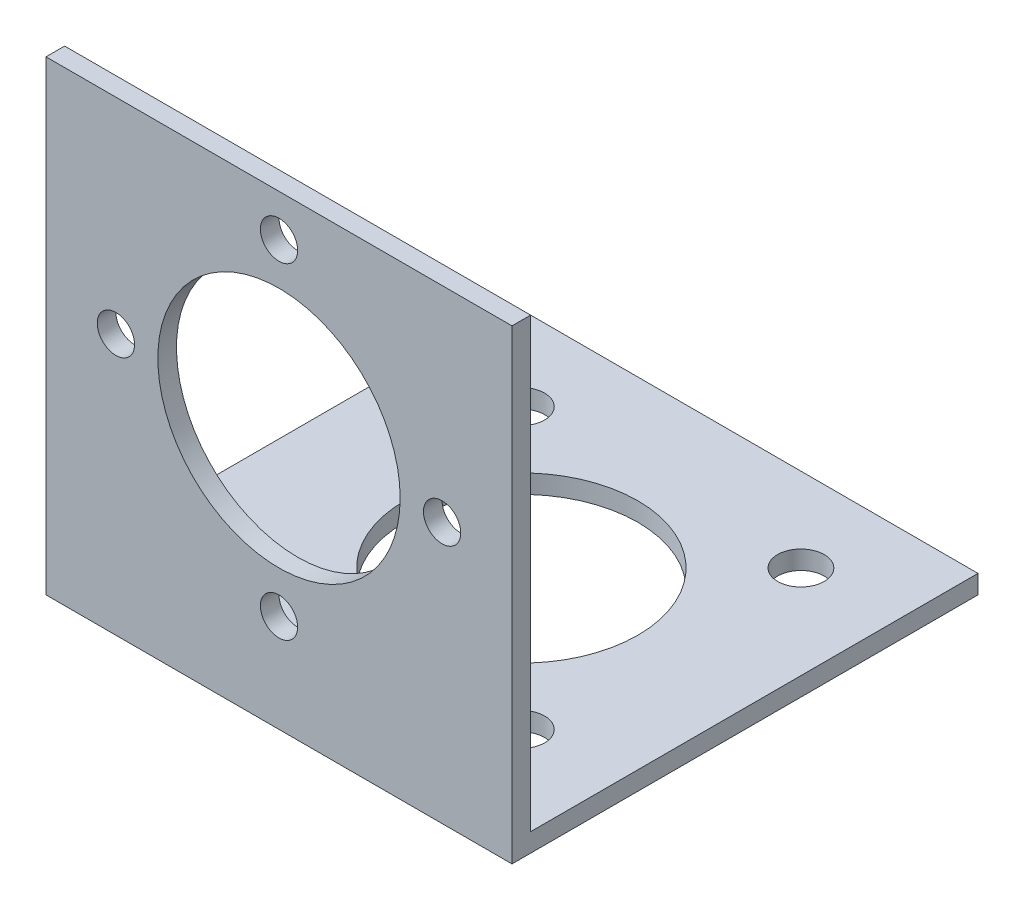
ISO-10303-21;
HEADER;
FILE_DESCRIPTION(('STEP AP214'),'2;1');
FILE_NAME('part.step','',(''),(''),'','','');
FILE_SCHEMA(('AUTOMOTIVE_DESIGN { 1 0 10303 214 1 1 1 1 }'));
ENDSEC;
DATA;
#1=APPLICATION_CONTEXT('core data for automotive mechanical design processes');
#2=APPLICATION_PROTOCOL_DEFINITION('international standard','automotive_design',2000,#1);
#3=PRODUCT_CONTEXT('',#1,'mechanical');
#4=PRODUCT('Part','Part','',(#3));
#5=PRODUCT_RELATED_PRODUCT_CATEGORY('part','',(#4));
#6=PRODUCT_DEFINITION_FORMATION('','',#4);
#7=PRODUCT_DEFINITION_CONTEXT('part definition',#1,'design');
#8=PRODUCT_DEFINITION('design','',#6,#7);
#9=PRODUCT_DEFINITION_SHAPE('','',#8);
#10=(LENGTH_UNIT() NAMED_UNIT(*) SI_UNIT(.MILLI.,.METRE.));
#11=(NAMED_UNIT(*) PLANE_ANGLE_UNIT() SI_UNIT($,.RADIAN.));
#12=(NAMED_UNIT(*) SI_UNIT($,.STERADIAN.) SOLID_ANGLE_UNIT());
#13=UNCERTAINTY_MEASURE_WITH_UNIT(LENGTH_MEASURE(1.E-05),#10,'distance_accuracy_value','');
#14=(GEOMETRIC_REPRESENTATION_CONTEXT(3) GLOBAL_UNCERTAINTY_ASSIGNED_CONTEXT((#13)) GLOBAL_UNIT_ASSIGNED_CONTEXT((#10,
#11,#12)) REPRESENTATION_CONTEXT('',''));
#15=CARTESIAN_POINT('',(0.,0.,0.));
#16=DIRECTION('',(0.,0.,1.));
#17=DIRECTION('',(1.,0.,0.));
#18=AXIS2_PLACEMENT_3D('',#15,#16,#17);
#19=CARTESIAN_POINT('',(50.,50.,-2.));
#20=DIRECTION('',(0.,-1.,0.));
#21=DIRECTION('',(0.,0.,-1.));
#22=AXIS2_PLACEMENT_3D('',#19,#20,#21);
#23=PLANE('',#22);
#24=DIRECTION('',(0.,0.,1.));
#25=VECTOR('',#24,1.);
#26=CARTESIAN_POINT('',(0.,50.,-2.));
#27=LINE('',#26,#25);
#28=CARTESIAN_POINT('',(0.,50.,-2.));
#29=VERTEX_POINT('',#28);
#30=CARTESIAN_POINT('',(0.,50.,0.));
#31=VERTEX_POINT('',#30);
#32=EDGE_CURVE('E121',#29,#31,#27,.T.);
#33=ORIENTED_EDGE('',*,*,#32,.T.);
#34=DIRECTION('',(-1.,0.,0.));
#35=VECTOR('',#34,1.);
#36=CARTESIAN_POINT('',(50.,50.,0.));
#37=LINE('',#36,#35);
#38=CARTESIAN_POINT('',(50.,50.,0.));
#39=VERTEX_POINT('',#38);
#40=EDGE_CURVE('E11',#39,#31,#37,.T.);
#41=ORIENTED_EDGE('',*,*,#40,.F.);
#42=DIRECTION('',(0.,0.,1.));
#43=VECTOR('',#42,1.);
#44=CARTESIAN_POINT('',(50.,50.,-2.));
#45=LINE('',#44,#43);
#46=CARTESIAN_POINT('',(50.,50.,-2.));
#47=VERTEX_POINT('',#46);
#48=EDGE_CURVE('E131',#47,#39,#45,.T.);
#49=ORIENTED_EDGE('',*,*,#48,.F.);
#50=DIRECTION('',(-1.,0.,0.));
#51=VECTOR('',#50,1.);
#52=CARTESIAN_POINT('',(50.,50.,-2.));
#53=LINE('',#52,#51);
#54=EDGE_CURVE('E117',#47,#29,#53,.T.);
#55=ORIENTED_EDGE('',*,*,#54,.T.);
#56=EDGE_LOOP('',(#33,#41,#49,#55));
#57=FACE_BOUND('',#56,.T.);
#58=ADVANCED_FACE('F35',(#57),#23,.F.);
#59=CARTESIAN_POINT('',(50.,50.,0.));
#60=DIRECTION('',(0.,0.,-1.));
#61=DIRECTION('',(-1.,0.,0.));
#62=AXIS2_PLACEMENT_3D('',#59,#60,#61);
#63=PLANE('',#62);
#64=CARTESIAN_POINT('',(7.5,28.,0.));
#65=DIRECTION('',(0.,0.,1.));
#66=DIRECTION('',(1.,0.,0.));
#67=AXIS2_PLACEMENT_3D('',#64,#65,#66);
#68=CIRCLE('',#67,2.);
#69=CARTESIAN_POINT('',(9.5,28.,0.));
#70=VERTEX_POINT('',#69);
#71=EDGE_CURVE('E193',#70,#70,#68,.T.);
#72=ORIENTED_EDGE('',*,*,#71,.F.);
#73=EDGE_LOOP('',(#72));
#74=FACE_BOUND('',#73,.T.);
#75=CARTESIAN_POINT('',(25.,45.5,0.));
#76=DIRECTION('',(0.,0.,1.));
#77=DIRECTION('',(1.,0.,0.));
#78=AXIS2_PLACEMENT_3D('',#75,#76,#77);
#79=CIRCLE('',#78,2.00000000000001);
#80=CARTESIAN_POINT('',(27.,45.5,0.));
#81=VERTEX_POINT('',#80);
#82=EDGE_CURVE('E194',#81,#81,#79,.T.);
#83=ORIENTED_EDGE('',*,*,#82,.F.);
#84=EDGE_LOOP('',(#83));
#85=FACE_BOUND('',#84,.T.);
#86=CARTESIAN_POINT('',(25.,10.5,0.));
#87=DIRECTION('',(0.,0.,1.));
#88=DIRECTION('',(1.,0.,0.));
#89=AXIS2_PLACEMENT_3D('',#86,#87,#88);
#90=CIRCLE('',#89,2.);
#91=CARTESIAN_POINT('',(27.,10.5,0.));
#92=VERTEX_POINT('',#91);
#93=EDGE_CURVE('E197',#92,#92,#90,.T.);
#94=ORIENTED_EDGE('',*,*,#93,.F.);
#95=EDGE_LOOP('',(#94));
#96=FACE_BOUND('',#95,.T.);
#97=CARTESIAN_POINT('',(42.5,28.,0.));
#98=DIRECTION('',(0.,0.,1.));
#99=DIRECTION('',(1.,0.,0.));
#100=AXIS2_PLACEMENT_3D('',#97,#98,#99);
#101=CIRCLE('',#100,2.);
#102=CARTESIAN_POINT('',(44.5,28.,0.));
#103=VERTEX_POINT('',#102);
#104=EDGE_CURVE('E199',#103,#103,#101,.T.);
#105=ORIENTED_EDGE('',*,*,#104,.F.);
#106=EDGE_LOOP('',(#105));
#107=FACE_BOUND('',#106,.T.);
#108=CARTESIAN_POINT('',(25.,28.,0.));
#109=DIRECTION('',(0.,0.,1.));
#110=DIRECTION('',(1.,0.,0.));
#111=AXIS2_PLACEMENT_3D('',#108,#109,#110);
#112=CIRCLE('',#111,13.);
#113=CARTESIAN_POINT('',(38.,28.,0.));
#114=VERTEX_POINT('',#113);
#115=EDGE_CURVE('E141',#114,#114,#112,.T.);
#116=ORIENTED_EDGE('',*,*,#115,.F.);
#117=EDGE_LOOP('',(#116));
#118=FACE_BOUND('',#117,.T.);
#119=DIRECTION('',(0.,-1.,0.));
#120=VECTOR('',#119,1.);
#121=CARTESIAN_POINT('',(0.,50.,0.));
#122=LINE('',#121,#120);
#123=CARTESIAN_POINT('',(0.,0.,0.));
#124=VERTEX_POINT('',#123);
#125=EDGE_CURVE('E124',#31,#124,#122,.T.);
#126=ORIENTED_EDGE('',*,*,#125,.T.);
#127=DIRECTION('',(-1.,0.,0.));
#128=VECTOR('',#127,1.);
#129=CARTESIAN_POINT('',(50.,0.,0.));
#130=LINE('',#129,#128);
#131=CARTESIAN_POINT('',(50.,0.,0.));
#132=VERTEX_POINT('',#131);
#133=EDGE_CURVE('E44',#132,#124,#130,.T.);
#134=ORIENTED_EDGE('',*,*,#133,.F.);
#135=DIRECTION('',(0.,-1.,0.));
#136=VECTOR('',#135,1.);
#137=CARTESIAN_POINT('',(50.,50.,0.));
#138=LINE('',#137,#136);
#139=EDGE_CURVE('E90',#39,#132,#138,.T.);
#140=ORIENTED_EDGE('',*,*,#139,.F.);
#141=ORIENTED_EDGE('',*,*,#40,.T.);
#142=EDGE_LOOP('',(#126,#134,#140,#141));
#143=FACE_BOUND('',#142,.T.);
#144=ADVANCED_FACE('F174',(#74,#85,#96,#107,#118,#143),#63,.F.);
#145=CARTESIAN_POINT('',(50.,0.,0.));
#146=DIRECTION('',(0.,1.,0.));
#147=DIRECTION('',(0.,0.,1.));
#148=AXIS2_PLACEMENT_3D('',#145,#146,#147);
#149=PLANE('',#148);
#150=CARTESIAN_POINT('',(10.,0.,-11.));
#151=DIRECTION('',(0.,1.,0.));
#152=DIRECTION('',(0.,0.,1.));
#153=AXIS2_PLACEMENT_3D('',#150,#151,#152);
#154=CIRCLE('',#153,2.5);
#155=CARTESIAN_POINT('',(10.,0.,-8.5));
#156=VERTEX_POINT('',#155);
#157=EDGE_CURVE('E202',#156,#156,#154,.T.);
#158=ORIENTED_EDGE('',*,*,#157,.T.);
#159=EDGE_LOOP('',(#158));
#160=FACE_BOUND('',#159,.T.);
#161=CARTESIAN_POINT('',(10.,0.,-41.));
#162=DIRECTION('',(0.,1.,0.));
#163=DIRECTION('',(0.,0.,1.));
#164=AXIS2_PLACEMENT_3D('',#161,#162,#163);
#165=CIRCLE('',#164,2.5);
#166=CARTESIAN_POINT('',(10.,0.,-38.5));
#167=VERTEX_POINT('',#166);
#168=EDGE_CURVE('E207',#167,#167,#165,.T.);
#169=ORIENTED_EDGE('',*,*,#168,.T.);
#170=EDGE_LOOP('',(#169));
#171=FACE_BOUND('',#170,.T.);
#172=CARTESIAN_POINT('',(40.,0.,-11.));
#173=DIRECTION('',(0.,1.,0.));
#174=DIRECTION('',(0.,0.,1.));
#175=AXIS2_PLACEMENT_3D('',#172,#173,#174);
#176=CIRCLE('',#175,2.5);
#177=CARTESIAN_POINT('',(40.,0.,-8.5));
#178=VERTEX_POINT('',#177);
#179=EDGE_CURVE('E210',#178,#178,#176,.T.);
#180=ORIENTED_EDGE('',*,*,#179,.T.);
#181=EDGE_LOOP('',(#180));
#182=FACE_BOUND('',#181,.T.);
#183=CARTESIAN_POINT('',(40.,0.,-41.));
#184=DIRECTION('',(0.,1.,0.));
#185=DIRECTION('',(0.,0.,1.));
#186=AXIS2_PLACEMENT_3D('',#183,#184,#185);
#187=CIRCLE('',#186,2.5);
#188=CARTESIAN_POINT('',(40.,0.,-38.5));
#189=VERTEX_POINT('',#188);
#190=EDGE_CURVE('E213',#189,#189,#187,.T.);
#191=ORIENTED_EDGE('',*,*,#190,.T.);
#192=EDGE_LOOP('',(#191));
#193=FACE_BOUND('',#192,.T.);
#194=CARTESIAN_POINT('',(25.,0.,-26.));
#195=DIRECTION('',(0.,1.,0.));
#196=DIRECTION('',(0.,0.,1.));
#197=AXIS2_PLACEMENT_3D('',#194,#195,#196);
#198=CIRCLE('',#197,12.5);
#199=CARTESIAN_POINT('',(25.,0.,-13.5));
#200=VERTEX_POINT('',#199);
#201=EDGE_CURVE('E216',#200,#200,#198,.T.);
#202=ORIENTED_EDGE('',*,*,#201,.T.);
#203=EDGE_LOOP('',(#202));
#204=FACE_BOUND('',#203,.T.);
#205=DIRECTION('',(0.,0.,-1.));
#206=VECTOR('',#205,1.);
#207=CARTESIAN_POINT('',(0.,0.,0.));
#208=LINE('',#207,#206);
#209=CARTESIAN_POINT('',(0.,0.,-50.));
#210=VERTEX_POINT('',#209);
#211=EDGE_CURVE('E126',#124,#210,#208,.T.);
#212=ORIENTED_EDGE('',*,*,#211,.T.);
#213=DIRECTION('',(-1.,0.,0.));
#214=VECTOR('',#213,1.);
#215=CARTESIAN_POINT('',(50.,0.,-50.));
#216=LINE('',#215,#214);
#217=CARTESIAN_POINT('',(50.,0.,-50.));
#218=VERTEX_POINT('',#217);
#219=EDGE_CURVE('E112',#218,#210,#216,.T.);
#220=ORIENTED_EDGE('',*,*,#219,.F.);
#221=DIRECTION('',(0.,0.,-1.));
#222=VECTOR('',#221,1.);
#223=CARTESIAN_POINT('',(50.,0.,0.));
#224=LINE('',#223,#222);
#225=EDGE_CURVE('E103',#132,#218,#224,.T.);
#226=ORIENTED_EDGE('',*,*,#225,.F.);
#227=ORIENTED_EDGE('',*,*,#133,.T.);
#228=EDGE_LOOP('',(#212,#220,#226,#227));
#229=FACE_BOUND('',#228,.T.);
#230=ADVANCED_FACE('F179',(#160,#171,#182,#193,#204,#229),#149,.F.);
#231=CARTESIAN_POINT('',(50.,0.,-50.));
#232=DIRECTION('',(0.,0.,1.));
#233=DIRECTION('',(1.,0.,0.));
#234=AXIS2_PLACEMENT_3D('',#231,#232,#233);
#235=PLANE('',#234);
#236=DIRECTION('',(0.,1.,0.));
#237=VECTOR('',#236,1.);
#238=CARTESIAN_POINT('',(0.,0.,-50.));
#239=LINE('',#238,#237);
#240=CARTESIAN_POINT('',(0.,2.,-50.));
#241=VERTEX_POINT('',#240);
#242=EDGE_CURVE('E111',#210,#241,#239,.T.);
#243=ORIENTED_EDGE('',*,*,#242,.T.);
#244=DIRECTION('',(-1.,0.,0.));
#245=VECTOR('',#244,1.);
#246=CARTESIAN_POINT('',(50.,2.,-50.));
#247=LINE('',#246,#245);
#248=CARTESIAN_POINT('',(50.,2.,-50.));
#249=VERTEX_POINT('',#248);
#250=EDGE_CURVE('E108',#249,#241,#247,.T.);
#251=ORIENTED_EDGE('',*,*,#250,.F.);
#252=DIRECTION('',(0.,1.,0.));
#253=VECTOR('',#252,1.);
#254=CARTESIAN_POINT('',(50.,0.,-50.));
#255=LINE('',#254,#253);
#256=EDGE_CURVE('E97',#218,#249,#255,.T.);
#257=ORIENTED_EDGE('',*,*,#256,.F.);
#258=ORIENTED_EDGE('',*,*,#219,.T.);
#259=EDGE_LOOP('',(#243,#251,#257,#258));
#260=FACE_BOUND('',#259,.T.);
#261=ADVANCED_FACE('F109',(#260),#235,.F.);
#262=CARTESIAN_POINT('',(50.,2.,-50.));
#263=DIRECTION('',(0.,-1.,0.));
#264=DIRECTION('',(0.,0.,-1.));
#265=AXIS2_PLACEMENT_3D('',#262,#263,#264);
#266=PLANE('',#265);
#267=CARTESIAN_POINT('',(10.,1.99999999999999,-11.));
#268=DIRECTION('',(0.,1.,0.));
#269=DIRECTION('',(0.,0.,1.));
#270=AXIS2_PLACEMENT_3D('',#267,#268,#269);
#271=CIRCLE('',#270,2.5);
#272=CARTESIAN_POINT('',(10.,1.99999999999999,-8.5));
#273=VERTEX_POINT('',#272);
#274=EDGE_CURVE('E223',#273,#273,#271,.T.);
#275=ORIENTED_EDGE('',*,*,#274,.F.);
#276=EDGE_LOOP('',(#275));
#277=FACE_BOUND('',#276,.T.);
#278=CARTESIAN_POINT('',(10.,2.,-41.));
#279=DIRECTION('',(0.,1.,0.));
#280=DIRECTION('',(0.,0.,1.));
#281=AXIS2_PLACEMENT_3D('',#278,#279,#280);
#282=CIRCLE('',#281,2.5);
#283=CARTESIAN_POINT('',(10.,2.,-38.5));
#284=VERTEX_POINT('',#283);
#285=EDGE_CURVE('E226',#284,#284,#282,.T.);
#286=ORIENTED_EDGE('',*,*,#285,.F.);
#287=EDGE_LOOP('',(#286));
#288=FACE_BOUND('',#287,.T.);
#289=CARTESIAN_POINT('',(40.,1.99999999999999,-11.));
#290=DIRECTION('',(0.,1.,0.));
#291=DIRECTION('',(0.,0.,1.));
#292=AXIS2_PLACEMENT_3D('',#289,#290,#291);
#293=CIRCLE('',#292,2.5);
#294=CARTESIAN_POINT('',(40.,1.99999999999999,-8.5));
#295=VERTEX_POINT('',#294);
#296=EDGE_CURVE('E229',#295,#295,#293,.T.);
#297=ORIENTED_EDGE('',*,*,#296,.F.);
#298=EDGE_LOOP('',(#297));
#299=FACE_BOUND('',#298,.T.);
#300=CARTESIAN_POINT('',(40.,2.,-41.));
#301=DIRECTION('',(0.,1.,0.));
#302=DIRECTION('',(0.,0.,1.));
#303=AXIS2_PLACEMENT_3D('',#300,#301,#302);
#304=CIRCLE('',#303,2.5);
#305=CARTESIAN_POINT('',(40.,2.,-38.5));
#306=VERTEX_POINT('',#305);
#307=EDGE_CURVE('E222',#306,#306,#304,.T.);
#308=ORIENTED_EDGE('',*,*,#307,.F.);
#309=EDGE_LOOP('',(#308));
#310=FACE_BOUND('',#309,.T.);
#311=CARTESIAN_POINT('',(25.,2.,-26.));
#312=DIRECTION('',(0.,1.,0.));
#313=DIRECTION('',(0.,0.,1.));
#314=AXIS2_PLACEMENT_3D('',#311,#312,#313);
#315=CIRCLE('',#314,12.5);
#316=CARTESIAN_POINT('',(25.,2.,-13.5));
#317=VERTEX_POINT('',#316);
#318=EDGE_CURVE('E219',#317,#317,#315,.T.);
#319=ORIENTED_EDGE('',*,*,#318,.F.);
#320=EDGE_LOOP('',(#319));
#321=FACE_BOUND('',#320,.T.);
#322=DIRECTION('',(0.,0.,1.));
#323=VECTOR('',#322,1.);
#324=CARTESIAN_POINT('',(0.,2.,-50.));
#325=LINE('',#324,#323);
#326=CARTESIAN_POINT('',(0.,1.99999999999999,-2.));
#327=VERTEX_POINT('',#326);
#328=EDGE_CURVE('E76',#241,#327,#325,.T.);
#329=ORIENTED_EDGE('',*,*,#328,.T.);
#330=DIRECTION('',(-1.,0.,0.));
#331=VECTOR('',#330,1.);
#332=CARTESIAN_POINT('',(50.,1.99999999999999,-2.));
#333=LINE('',#332,#331);
#334=CARTESIAN_POINT('',(50.,1.99999999999999,-2.));
#335=VERTEX_POINT('',#334);
#336=EDGE_CURVE('E113',#335,#327,#333,.T.);
#337=ORIENTED_EDGE('',*,*,#336,.F.);
#338=DIRECTION('',(0.,0.,1.));
#339=VECTOR('',#338,1.);
#340=CARTESIAN_POINT('',(50.,2.,-50.));
#341=LINE('',#340,#339);
#342=EDGE_CURVE('E101',#249,#335,#341,.T.);
#343=ORIENTED_EDGE('',*,*,#342,.F.);
#344=ORIENTED_EDGE('',*,*,#250,.T.);
#345=EDGE_LOOP('',(#329,#337,#343,#344));
#346=FACE_BOUND('',#345,.T.);
#347=ADVANCED_FACE('F115',(#277,#288,#299,#310,#321,#346),#266,.F.);
#348=CARTESIAN_POINT('',(50.,1.99999999999999,-2.));
#349=DIRECTION('',(0.,0.,1.));
#350=DIRECTION('',(0.,-1.,0.));
#351=AXIS2_PLACEMENT_3D('',#348,#349,#350);
#352=PLANE('',#351);
#353=CARTESIAN_POINT('',(7.5,28.,-2.));
#354=DIRECTION('',(0.,0.,1.));
#355=DIRECTION('',(0.,-1.,0.));
#356=AXIS2_PLACEMENT_3D('',#353,#354,#355);
#357=CIRCLE('',#356,2.);
#358=CARTESIAN_POINT('',(7.5,26.,-2.));
#359=VERTEX_POINT('',#358);
#360=EDGE_CURVE('E38',#359,#359,#357,.T.);
#361=ORIENTED_EDGE('',*,*,#360,.T.);
#362=EDGE_LOOP('',(#361));
#363=FACE_BOUND('',#362,.T.);
#364=CARTESIAN_POINT('',(25.,45.5,-2.));
#365=DIRECTION('',(0.,0.,1.));
#366=DIRECTION('',(0.,-1.,0.));
#367=AXIS2_PLACEMENT_3D('',#364,#365,#366);
#368=CIRCLE('',#367,2.00000000000001);
#369=CARTESIAN_POINT('',(25.,43.5,-2.));
#370=VERTEX_POINT('',#369);
#371=EDGE_CURVE('E146',#370,#370,#368,.T.);
#372=ORIENTED_EDGE('',*,*,#371,.T.);
#373=EDGE_LOOP('',(#372));
#374=FACE_BOUND('',#373,.T.);
#375=CARTESIAN_POINT('',(25.,10.5,-2.));
#376=DIRECTION('',(0.,0.,1.));
#377=DIRECTION('',(0.,-1.,0.));
#378=AXIS2_PLACEMENT_3D('',#375,#376,#377);
#379=CIRCLE('',#378,2.);
#380=CARTESIAN_POINT('',(25.,8.49999999999999,-2.));
#381=VERTEX_POINT('',#380);
#382=EDGE_CURVE('E144',#381,#381,#379,.T.);
#383=ORIENTED_EDGE('',*,*,#382,.T.);
#384=EDGE_LOOP('',(#383));
#385=FACE_BOUND('',#384,.T.);
#386=CARTESIAN_POINT('',(42.5,28.,-2.));
#387=DIRECTION('',(0.,0.,1.));
#388=DIRECTION('',(0.,-1.,0.));
#389=AXIS2_PLACEMENT_3D('',#386,#387,#388);
#390=CIRCLE('',#389,2.);
#391=CARTESIAN_POINT('',(42.5,26.,-2.));
#392=VERTEX_POINT('',#391);
#393=EDGE_CURVE('E140',#392,#392,#390,.T.);
#394=ORIENTED_EDGE('',*,*,#393,.T.);
#395=EDGE_LOOP('',(#394));
#396=FACE_BOUND('',#395,.T.);
#397=CARTESIAN_POINT('',(25.,28.,-2.));
#398=DIRECTION('',(0.,0.,1.));
#399=DIRECTION('',(0.,-1.,0.));
#400=AXIS2_PLACEMENT_3D('',#397,#398,#399);
#401=CIRCLE('',#400,13.);
#402=CARTESIAN_POINT('',(25.,15.,-2.));
#403=VERTEX_POINT('',#402);
#404=EDGE_CURVE('E137',#403,#403,#401,.T.);
#405=ORIENTED_EDGE('',*,*,#404,.T.);
#406=EDGE_LOOP('',(#405));
#407=FACE_BOUND('',#406,.T.);
#408=DIRECTION('',(0.,1.,0.));
#409=VECTOR('',#408,1.);
#410=CARTESIAN_POINT('',(0.,1.99999999999999,-2.));
#411=LINE('',#410,#409);
#412=EDGE_CURVE('E82',#327,#29,#411,.T.);
#413=ORIENTED_EDGE('',*,*,#412,.T.);
#414=ORIENTED_EDGE('',*,*,#54,.F.);
#415=DIRECTION('',(0.,1.,0.));
#416=VECTOR('',#415,1.);
#417=CARTESIAN_POINT('',(50.,1.99999999999999,-2.));
#418=LINE('',#417,#416);
#419=EDGE_CURVE('E53',#335,#47,#418,.T.);
#420=ORIENTED_EDGE('',*,*,#419,.F.);
#421=ORIENTED_EDGE('',*,*,#336,.T.);
#422=EDGE_LOOP('',(#413,#414,#420,#421));
#423=FACE_BOUND('',#422,.T.);
#424=ADVANCED_FACE('F153',(#363,#374,#385,#396,#407,#423),#352,.F.);
#425=CARTESIAN_POINT('',(50.,0.,0.));
#426=DIRECTION('',(1.,0.,0.));
#427=DIRECTION('',(0.,0.,-1.));
#428=AXIS2_PLACEMENT_3D('',#425,#426,#427);
#429=PLANE('',#428);
#430=ORIENTED_EDGE('',*,*,#48,.T.);
#431=ORIENTED_EDGE('',*,*,#139,.T.);
#432=ORIENTED_EDGE('',*,*,#225,.T.);
#433=ORIENTED_EDGE('',*,*,#256,.T.);
#434=ORIENTED_EDGE('',*,*,#342,.T.);
#435=ORIENTED_EDGE('',*,*,#419,.T.);
#436=EDGE_LOOP('',(#430,#431,#432,#433,#434,#435));
#437=FACE_BOUND('',#436,.T.);
#438=ADVANCED_FACE('F99',(#437),#429,.T.);
#439=CARTESIAN_POINT('',(0.,0.,0.));
#440=DIRECTION('',(1.,0.,0.));
#441=DIRECTION('',(0.,0.,-1.));
#442=AXIS2_PLACEMENT_3D('',#439,#440,#441);
#443=PLANE('',#442);
#444=ORIENTED_EDGE('',*,*,#32,.F.);
#445=ORIENTED_EDGE('',*,*,#412,.F.);
#446=ORIENTED_EDGE('',*,*,#328,.F.);
#447=ORIENTED_EDGE('',*,*,#242,.F.);
#448=ORIENTED_EDGE('',*,*,#211,.F.);
#449=ORIENTED_EDGE('',*,*,#125,.F.);
#450=EDGE_LOOP('',(#444,#445,#446,#447,#448,#449));
#451=FACE_BOUND('',#450,.T.);
#452=ADVANCED_FACE('F185',(#451),#443,.F.);
#453=CARTESIAN_POINT('',(25.,28.,-50.));
#454=DIRECTION('',(0.,0.,1.));
#455=DIRECTION('',(1.,0.,0.));
#456=AXIS2_PLACEMENT_3D('',#453,#454,#455);
#457=CYLINDRICAL_SURFACE('',#456,13.);
#458=ORIENTED_EDGE('',*,*,#115,.T.);
#459=EDGE_LOOP('',(#458));
#460=FACE_BOUND('',#459,.T.);
#461=ORIENTED_EDGE('',*,*,#404,.F.);
#462=EDGE_LOOP('',(#461));
#463=FACE_BOUND('',#462,.T.);
#464=ADVANCED_FACE('F258',(#460,#463),#457,.F.);
#465=CARTESIAN_POINT('',(42.5,28.,-50.));
#466=DIRECTION('',(0.,0.,1.));
#467=DIRECTION('',(1.,0.,0.));
#468=AXIS2_PLACEMENT_3D('',#465,#466,#467);
#469=CYLINDRICAL_SURFACE('',#468,2.);
#470=ORIENTED_EDGE('',*,*,#104,.T.);
#471=EDGE_LOOP('',(#470));
#472=FACE_BOUND('',#471,.T.);
#473=ORIENTED_EDGE('',*,*,#393,.F.);
#474=EDGE_LOOP('',(#473));
#475=FACE_BOUND('',#474,.T.);
#476=ADVANCED_FACE('F262',(#472,#475),#469,.F.);
#477=CARTESIAN_POINT('',(25.,10.5,-50.));
#478=DIRECTION('',(0.,0.,1.));
#479=DIRECTION('',(1.,0.,0.));
#480=AXIS2_PLACEMENT_3D('',#477,#478,#479);
#481=CYLINDRICAL_SURFACE('',#480,2.);
#482=ORIENTED_EDGE('',*,*,#93,.T.);
#483=EDGE_LOOP('',(#482));
#484=FACE_BOUND('',#483,.T.);
#485=ORIENTED_EDGE('',*,*,#382,.F.);
#486=EDGE_LOOP('',(#485));
#487=FACE_BOUND('',#486,.T.);
#488=ADVANCED_FACE('F168',(#484,#487),#481,.F.);
#489=CARTESIAN_POINT('',(25.,45.5,-50.));
#490=DIRECTION('',(0.,0.,1.));
#491=DIRECTION('',(1.,0.,0.));
#492=AXIS2_PLACEMENT_3D('',#489,#490,#491);
#493=CYLINDRICAL_SURFACE('',#492,2.00000000000001);
#494=ORIENTED_EDGE('',*,*,#82,.T.);
#495=EDGE_LOOP('',(#494));
#496=FACE_BOUND('',#495,.T.);
#497=ORIENTED_EDGE('',*,*,#371,.F.);
#498=EDGE_LOOP('',(#497));
#499=FACE_BOUND('',#498,.T.);
#500=ADVANCED_FACE('F158',(#496,#499),#493,.F.);
#501=CARTESIAN_POINT('',(7.5,28.,-50.));
#502=DIRECTION('',(0.,0.,1.));
#503=DIRECTION('',(1.,0.,0.));
#504=AXIS2_PLACEMENT_3D('',#501,#502,#503);
#505=CYLINDRICAL_SURFACE('',#504,2.);
#506=ORIENTED_EDGE('',*,*,#71,.T.);
#507=EDGE_LOOP('',(#506));
#508=FACE_BOUND('',#507,.T.);
#509=ORIENTED_EDGE('',*,*,#360,.F.);
#510=EDGE_LOOP('',(#509));
#511=FACE_BOUND('',#510,.T.);
#512=ADVANCED_FACE('F155',(#508,#511),#505,.F.);
#513=CARTESIAN_POINT('',(25.,-48.,-26.));
#514=DIRECTION('',(0.,1.,0.));
#515=DIRECTION('',(0.,0.,1.));
#516=AXIS2_PLACEMENT_3D('',#513,#514,#515);
#517=CYLINDRICAL_SURFACE('',#516,12.5);
#518=ORIENTED_EDGE('',*,*,#318,.T.);
#519=EDGE_LOOP('',(#518));
#520=FACE_BOUND('',#519,.T.);
#521=ORIENTED_EDGE('',*,*,#201,.F.);
#522=EDGE_LOOP('',(#521));
#523=FACE_BOUND('',#522,.T.);
#524=ADVANCED_FACE('F157',(#520,#523),#517,.F.);
#525=CARTESIAN_POINT('',(40.,-48.,-41.));
#526=DIRECTION('',(0.,1.,0.));
#527=DIRECTION('',(0.,0.,1.));
#528=AXIS2_PLACEMENT_3D('',#525,#526,#527);
#529=CYLINDRICAL_SURFACE('',#528,2.5);
#530=ORIENTED_EDGE('',*,*,#307,.T.);
#531=EDGE_LOOP('',(#530));
#532=FACE_BOUND('',#531,.T.);
#533=ORIENTED_EDGE('',*,*,#190,.F.);
#534=EDGE_LOOP('',(#533));
#535=FACE_BOUND('',#534,.T.);
#536=ADVANCED_FACE('F165',(#532,#535),#529,.F.);
#537=CARTESIAN_POINT('',(40.,-48.,-11.));
#538=DIRECTION('',(0.,1.,0.));
#539=DIRECTION('',(0.,0.,1.));
#540=AXIS2_PLACEMENT_3D('',#537,#538,#539);
#541=CYLINDRICAL_SURFACE('',#540,2.5);
#542=ORIENTED_EDGE('',*,*,#296,.T.);
#543=EDGE_LOOP('',(#542));
#544=FACE_BOUND('',#543,.T.);
#545=ORIENTED_EDGE('',*,*,#179,.F.);
#546=EDGE_LOOP('',(#545));
#547=FACE_BOUND('',#546,.T.);
#548=ADVANCED_FACE('F287',(#544,#547),#541,.F.);
#549=CARTESIAN_POINT('',(10.,-48.,-41.));
#550=DIRECTION('',(0.,1.,0.));
#551=DIRECTION('',(0.,0.,1.));
#552=AXIS2_PLACEMENT_3D('',#549,#550,#551);
#553=CYLINDRICAL_SURFACE('',#552,2.5);
#554=ORIENTED_EDGE('',*,*,#285,.T.);
#555=EDGE_LOOP('',(#554));
#556=FACE_BOUND('',#555,.T.);
#557=ORIENTED_EDGE('',*,*,#168,.F.);
#558=EDGE_LOOP('',(#557));
#559=FACE_BOUND('',#558,.T.);
#560=ADVANCED_FACE('F283',(#556,#559),#553,.F.);
#561=CARTESIAN_POINT('',(10.,-48.,-11.));
#562=DIRECTION('',(0.,1.,0.));
#563=DIRECTION('',(0.,0.,1.));
#564=AXIS2_PLACEMENT_3D('',#561,#562,#563);
#565=CYLINDRICAL_SURFACE('',#564,2.5);
#566=ORIENTED_EDGE('',*,*,#274,.T.);
#567=EDGE_LOOP('',(#566));
#568=FACE_BOUND('',#567,.T.);
#569=ORIENTED_EDGE('',*,*,#157,.F.);
#570=EDGE_LOOP('',(#569));
#571=FACE_BOUND('',#570,.T.);
#572=ADVANCED_FACE('F280',(#568,#571),#565,.F.);
#573=CLOSED_SHELL('',(#58,#144,#230,#261,#347,#424,#438,#452,#464,#476,#488,#500,#512,#524,#536,
#548,#560,#572));
#574=MANIFOLD_SOLID_BREP('B2',#573);
#575=ADVANCED_BREP_SHAPE_REPRESENTATION('',(#18,#574),#14);
#576=SHAPE_DEFINITION_REPRESENTATION(#9,#575);
ENDSEC;
END-ISO-10303-21;
